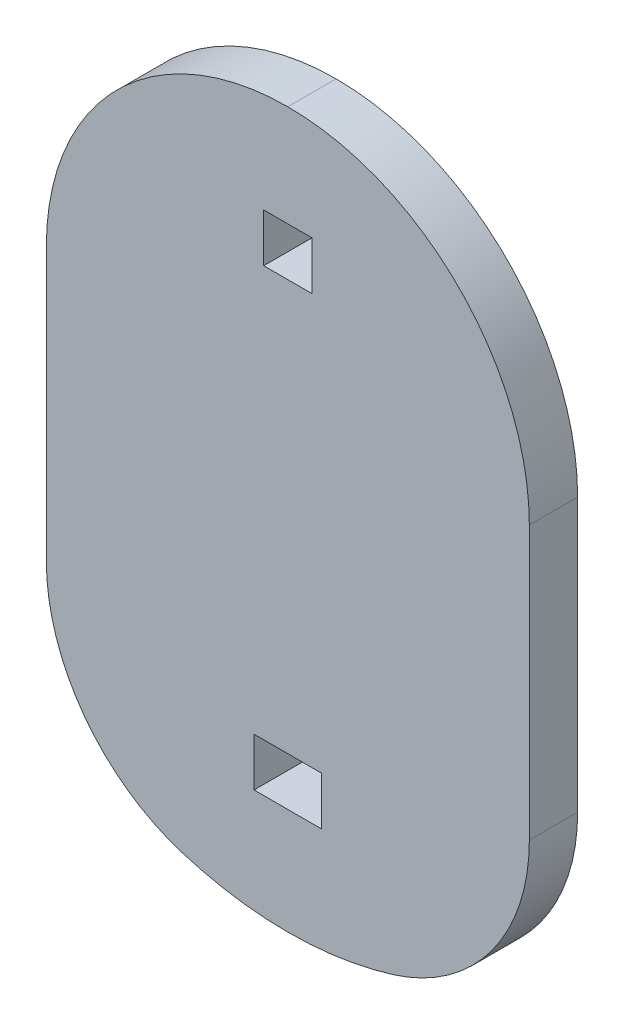
ISO-10303-21;
HEADER;
FILE_DESCRIPTION(('STEP AP214'),'2;1');
FILE_NAME('part.step','',(''),(''),'','','');
FILE_SCHEMA(('AUTOMOTIVE_DESIGN { 1 0 10303 214 1 1 1 1 }'));
ENDSEC;
DATA;
#1=APPLICATION_CONTEXT('core data for automotive mechanical design processes');
#2=APPLICATION_PROTOCOL_DEFINITION('international standard','automotive_design',2000,#1);
#3=PRODUCT_CONTEXT('',#1,'mechanical');
#4=PRODUCT('Part','Part','',(#3));
#5=PRODUCT_RELATED_PRODUCT_CATEGORY('part','',(#4));
#6=PRODUCT_DEFINITION_FORMATION('','',#4);
#7=PRODUCT_DEFINITION_CONTEXT('part definition',#1,'design');
#8=PRODUCT_DEFINITION('design','',#6,#7);
#9=PRODUCT_DEFINITION_SHAPE('','',#8);
#10=(LENGTH_UNIT() NAMED_UNIT(*) SI_UNIT(.MILLI.,.METRE.));
#11=(NAMED_UNIT(*) PLANE_ANGLE_UNIT() SI_UNIT($,.RADIAN.));
#12=(NAMED_UNIT(*) SI_UNIT($,.STERADIAN.) SOLID_ANGLE_UNIT());
#13=UNCERTAINTY_MEASURE_WITH_UNIT(LENGTH_MEASURE(1.E-05),#10,'distance_accuracy_value','');
#14=(GEOMETRIC_REPRESENTATION_CONTEXT(3) GLOBAL_UNCERTAINTY_ASSIGNED_CONTEXT((#13)) GLOBAL_UNIT_ASSIGNED_CONTEXT((#10,
#11,#12)) REPRESENTATION_CONTEXT('',''));
#15=CARTESIAN_POINT('',(0.,0.,0.));
#16=DIRECTION('',(0.,0.,1.));
#17=DIRECTION('',(1.,0.,0.));
#18=AXIS2_PLACEMENT_3D('',#15,#16,#17);
#19=CARTESIAN_POINT('',(0.,0.,5.));
#20=DIRECTION('',(0.,0.,-1.));
#21=DIRECTION('',(-1.,0.,0.));
#22=AXIS2_PLACEMENT_3D('',#19,#20,#21);
#23=CYLINDRICAL_SURFACE('',#22,37.);
#24=CARTESIAN_POINT('',(0.,0.,0.));
#25=DIRECTION('',(0.,0.,1.));
#26=DIRECTION('',(1.,0.,0.));
#27=AXIS2_PLACEMENT_3D('',#24,#25,#26);
#28=CIRCLE('',#27,37.);
#29=CARTESIAN_POINT('',(-10.8823529411765,-35.3634612907683,0.));
#30=VERTEX_POINT('',#29);
#31=CARTESIAN_POINT('',(10.8823529411765,-35.3634612907683,0.));
#32=VERTEX_POINT('',#31);
#33=EDGE_CURVE('E195',#30,#32,#28,.T.);
#34=ORIENTED_EDGE('',*,*,#33,.T.);
#35=DIRECTION('',(0.,0.,-1.));
#36=VECTOR('',#35,1.);
#37=CARTESIAN_POINT('',(10.8823529411765,-35.3634612907683,5.));
#38=LINE('',#37,#36);
#39=CARTESIAN_POINT('',(10.8823529411765,-35.3634612907683,5.));
#40=VERTEX_POINT('',#39);
#41=EDGE_CURVE('E227',#32,#40,#38,.F.);
#42=ORIENTED_EDGE('',*,*,#41,.T.);
#43=CARTESIAN_POINT('',(0.,0.,5.));
#44=DIRECTION('',(0.,0.,1.));
#45=DIRECTION('',(1.,0.,0.));
#46=AXIS2_PLACEMENT_3D('',#43,#44,#45);
#47=CIRCLE('',#46,37.);
#48=CARTESIAN_POINT('',(-10.8823529411765,-35.3634612907683,5.));
#49=VERTEX_POINT('',#48);
#50=EDGE_CURVE('E199',#49,#40,#47,.T.);
#51=ORIENTED_EDGE('',*,*,#50,.F.);
#52=DIRECTION('',(0.,0.,-1.));
#53=VECTOR('',#52,1.);
#54=CARTESIAN_POINT('',(-10.8823529411765,-35.3634612907683,5.));
#55=LINE('',#54,#53);
#56=EDGE_CURVE('E223',#49,#30,#55,.T.);
#57=ORIENTED_EDGE('',*,*,#56,.T.);
#58=EDGE_LOOP('',(#34,#42,#51,#57));
#59=FACE_BOUND('',#58,.T.);
#60=ADVANCED_FACE('F34',(#59),#23,.T.);
#61=CARTESIAN_POINT('',(0.,0.,5.));
#62=DIRECTION('',(0.,0.,1.));
#63=DIRECTION('',(1.,0.,0.));
#64=AXIS2_PLACEMENT_3D('',#61,#62,#63);
#65=PLANE('',#64);
#66=DIRECTION('',(0.,-1.,0.));
#67=VECTOR('',#66,1.);
#68=CARTESIAN_POINT('',(-2.5,26.5,5.));
#69=LINE('',#68,#67);
#70=CARTESIAN_POINT('',(-2.5,26.5,5.));
#71=VERTEX_POINT('',#70);
#72=CARTESIAN_POINT('',(-2.5,21.5,5.));
#73=VERTEX_POINT('',#72);
#74=EDGE_CURVE('E49',#71,#73,#69,.T.);
#75=ORIENTED_EDGE('',*,*,#74,.F.);
#76=DIRECTION('',(-1.,0.,0.));
#77=VECTOR('',#76,1.);
#78=CARTESIAN_POINT('',(-2.5,26.5,5.));
#79=LINE('',#78,#77);
#80=CARTESIAN_POINT('',(2.5,26.5,5.));
#81=VERTEX_POINT('',#80);
#82=EDGE_CURVE('E165',#81,#71,#79,.T.);
#83=ORIENTED_EDGE('',*,*,#82,.F.);
#84=DIRECTION('',(0.,1.,0.));
#85=VECTOR('',#84,1.);
#86=CARTESIAN_POINT('',(2.5,26.5,5.));
#87=LINE('',#86,#85);
#88=CARTESIAN_POINT('',(2.5,21.5,5.));
#89=VERTEX_POINT('',#88);
#90=EDGE_CURVE('E148',#89,#81,#87,.T.);
#91=ORIENTED_EDGE('',*,*,#90,.F.);
#92=DIRECTION('',(1.,0.,0.));
#93=VECTOR('',#92,1.);
#94=CARTESIAN_POINT('',(-2.5,21.5,5.));
#95=LINE('',#94,#93);
#96=EDGE_CURVE('E158',#73,#89,#95,.T.);
#97=ORIENTED_EDGE('',*,*,#96,.F.);
#98=EDGE_LOOP('',(#75,#83,#91,#97));
#99=FACE_BOUND('',#98,.T.);
#100=DIRECTION('',(0.,-1.,0.));
#101=VECTOR('',#100,1.);
#102=CARTESIAN_POINT('',(-3.5,-21.,5.));
#103=LINE('',#102,#101);
#104=CARTESIAN_POINT('',(-3.5,-21.,5.));
#105=VERTEX_POINT('',#104);
#106=CARTESIAN_POINT('',(-3.5,-26.,5.));
#107=VERTEX_POINT('',#106);
#108=EDGE_CURVE('E57',#105,#107,#103,.T.);
#109=ORIENTED_EDGE('',*,*,#108,.F.);
#110=DIRECTION('',(-1.,0.,0.));
#111=VECTOR('',#110,1.);
#112=CARTESIAN_POINT('',(-3.5,-21.,5.));
#113=LINE('',#112,#111);
#114=CARTESIAN_POINT('',(3.5,-21.,5.));
#115=VERTEX_POINT('',#114);
#116=EDGE_CURVE('E182',#115,#105,#113,.T.);
#117=ORIENTED_EDGE('',*,*,#116,.F.);
#118=DIRECTION('',(0.,1.,0.));
#119=VECTOR('',#118,1.);
#120=CARTESIAN_POINT('',(3.5,-21.,5.));
#121=LINE('',#120,#119);
#122=CARTESIAN_POINT('',(3.5,-26.,5.));
#123=VERTEX_POINT('',#122);
#124=EDGE_CURVE('E179',#123,#115,#121,.T.);
#125=ORIENTED_EDGE('',*,*,#124,.F.);
#126=DIRECTION('',(1.,0.,0.));
#127=VECTOR('',#126,1.);
#128=CARTESIAN_POINT('',(-3.5,-26.,5.));
#129=LINE('',#128,#127);
#130=EDGE_CURVE('E176',#107,#123,#129,.T.);
#131=ORIENTED_EDGE('',*,*,#130,.F.);
#132=EDGE_LOOP('',(#109,#117,#125,#131));
#133=FACE_BOUND('',#132,.T.);
#134=ORIENTED_EDGE('',*,*,#50,.T.);
#135=CARTESIAN_POINT('',(5.,-16.2480768092719,5.));
#136=DIRECTION('',(0.,0.,1.));
#137=DIRECTION('',(1.,0.,0.));
#138=AXIS2_PLACEMENT_3D('',#135,#136,#137);
#139=CIRCLE('',#138,20.);
#140=CARTESIAN_POINT('',(25.,-16.2480768092719,5.));
#141=VERTEX_POINT('',#140);
#142=EDGE_CURVE('E232',#40,#141,#139,.T.);
#143=ORIENTED_EDGE('',*,*,#142,.T.);
#144=DIRECTION('',(0.,-1.,0.));
#145=VECTOR('',#144,1.);
#146=CARTESIAN_POINT('',(25.,-27.2763633939717,5.));
#147=LINE('',#146,#145);
#148=CARTESIAN_POINT('',(25.,12.,5.));
#149=VERTEX_POINT('',#148);
#150=EDGE_CURVE('E196',#149,#141,#147,.T.);
#151=ORIENTED_EDGE('',*,*,#150,.F.);
#152=CARTESIAN_POINT('',(0.,12.,5.));
#153=DIRECTION('',(0.,0.,1.));
#154=DIRECTION('',(1.,0.,0.));
#155=AXIS2_PLACEMENT_3D('',#152,#153,#154);
#156=CIRCLE('',#155,25.);
#157=CARTESIAN_POINT('',(0.,37.,5.));
#158=VERTEX_POINT('',#157);
#159=EDGE_CURVE('E209',#149,#158,#156,.T.);
#160=ORIENTED_EDGE('',*,*,#159,.T.);
#161=CARTESIAN_POINT('',(0.,12.,5.));
#162=DIRECTION('',(0.,0.,1.));
#163=DIRECTION('',(1.,0.,0.));
#164=AXIS2_PLACEMENT_3D('',#161,#162,#163);
#165=CIRCLE('',#164,25.);
#166=CARTESIAN_POINT('',(-25.,12.,5.));
#167=VERTEX_POINT('',#166);
#168=EDGE_CURVE('E211',#158,#167,#165,.T.);
#169=ORIENTED_EDGE('',*,*,#168,.T.);
#170=DIRECTION('',(0.,1.,0.));
#171=VECTOR('',#170,1.);
#172=CARTESIAN_POINT('',(-25.,27.2763633939717,5.));
#173=LINE('',#172,#171);
#174=CARTESIAN_POINT('',(-25.,-16.2480768092719,5.));
#175=VERTEX_POINT('',#174);
#176=EDGE_CURVE('E193',#175,#167,#173,.T.);
#177=ORIENTED_EDGE('',*,*,#176,.F.);
#178=CARTESIAN_POINT('',(-4.99999999999999,-16.2480768092719,5.));
#179=DIRECTION('',(0.,0.,1.));
#180=DIRECTION('',(1.,0.,0.));
#181=AXIS2_PLACEMENT_3D('',#178,#179,#180);
#182=CIRCLE('',#181,20.);
#183=EDGE_CURVE('E230',#175,#49,#182,.T.);
#184=ORIENTED_EDGE('',*,*,#183,.T.);
#185=EDGE_LOOP('',(#134,#143,#151,#160,#169,#177,#184));
#186=FACE_BOUND('',#185,.T.);
#187=ADVANCED_FACE('F162',(#99,#133,#186),#65,.T.);
#188=CARTESIAN_POINT('',(0.,0.,0.));
#189=DIRECTION('',(0.,0.,1.));
#190=DIRECTION('',(1.,0.,0.));
#191=AXIS2_PLACEMENT_3D('',#188,#189,#190);
#192=PLANE('',#191);
#193=DIRECTION('',(-1.,0.,0.));
#194=VECTOR('',#193,1.);
#195=CARTESIAN_POINT('',(0.,26.5,0.));
#196=LINE('',#195,#194);
#197=CARTESIAN_POINT('',(2.5,26.5,0.));
#198=VERTEX_POINT('',#197);
#199=CARTESIAN_POINT('',(-2.5,26.5,0.));
#200=VERTEX_POINT('',#199);
#201=EDGE_CURVE('E42',#198,#200,#196,.T.);
#202=ORIENTED_EDGE('',*,*,#201,.T.);
#203=DIRECTION('',(0.,-1.,0.));
#204=VECTOR('',#203,1.);
#205=CARTESIAN_POINT('',(-2.5,0.,0.));
#206=LINE('',#205,#204);
#207=CARTESIAN_POINT('',(-2.5,21.5,0.));
#208=VERTEX_POINT('',#207);
#209=EDGE_CURVE('E11',#200,#208,#206,.T.);
#210=ORIENTED_EDGE('',*,*,#209,.T.);
#211=DIRECTION('',(1.,0.,0.));
#212=VECTOR('',#211,1.);
#213=CARTESIAN_POINT('',(0.,21.5,0.));
#214=LINE('',#213,#212);
#215=CARTESIAN_POINT('',(2.5,21.5,0.));
#216=VERTEX_POINT('',#215);
#217=EDGE_CURVE('E255',#208,#216,#214,.T.);
#218=ORIENTED_EDGE('',*,*,#217,.T.);
#219=DIRECTION('',(0.,1.,0.));
#220=VECTOR('',#219,1.);
#221=CARTESIAN_POINT('',(2.5,0.,0.));
#222=LINE('',#221,#220);
#223=EDGE_CURVE('E151',#216,#198,#222,.T.);
#224=ORIENTED_EDGE('',*,*,#223,.T.);
#225=EDGE_LOOP('',(#202,#210,#218,#224));
#226=FACE_BOUND('',#225,.T.);
#227=DIRECTION('',(-1.,0.,0.));
#228=VECTOR('',#227,1.);
#229=CARTESIAN_POINT('',(0.,-21.,0.));
#230=LINE('',#229,#228);
#231=CARTESIAN_POINT('',(3.5,-21.,0.));
#232=VERTEX_POINT('',#231);
#233=CARTESIAN_POINT('',(-3.5,-21.,0.));
#234=VERTEX_POINT('',#233);
#235=EDGE_CURVE('E249',#232,#234,#230,.T.);
#236=ORIENTED_EDGE('',*,*,#235,.T.);
#237=DIRECTION('',(0.,-1.,0.));
#238=VECTOR('',#237,1.);
#239=CARTESIAN_POINT('',(-3.5,0.,0.));
#240=LINE('',#239,#238);
#241=CARTESIAN_POINT('',(-3.5,-26.,0.));
#242=VERTEX_POINT('',#241);
#243=EDGE_CURVE('E252',#234,#242,#240,.T.);
#244=ORIENTED_EDGE('',*,*,#243,.T.);
#245=DIRECTION('',(1.,0.,0.));
#246=VECTOR('',#245,1.);
#247=CARTESIAN_POINT('',(0.,-26.,0.));
#248=LINE('',#247,#246);
#249=CARTESIAN_POINT('',(3.5,-26.,0.));
#250=VERTEX_POINT('',#249);
#251=EDGE_CURVE('E243',#242,#250,#248,.T.);
#252=ORIENTED_EDGE('',*,*,#251,.T.);
#253=DIRECTION('',(0.,1.,0.));
#254=VECTOR('',#253,1.);
#255=CARTESIAN_POINT('',(3.5,0.,0.));
#256=LINE('',#255,#254);
#257=EDGE_CURVE('E246',#250,#232,#256,.T.);
#258=ORIENTED_EDGE('',*,*,#257,.T.);
#259=EDGE_LOOP('',(#236,#244,#252,#258));
#260=FACE_BOUND('',#259,.T.);
#261=DIRECTION('',(0.,-1.,0.));
#262=VECTOR('',#261,1.);
#263=CARTESIAN_POINT('',(25.,0.,0.));
#264=LINE('',#263,#262);
#265=CARTESIAN_POINT('',(25.,12.,0.));
#266=VERTEX_POINT('',#265);
#267=CARTESIAN_POINT('',(25.,-16.2480768092719,0.));
#268=VERTEX_POINT('',#267);
#269=EDGE_CURVE('E202',#266,#268,#264,.T.);
#270=ORIENTED_EDGE('',*,*,#269,.T.);
#271=CARTESIAN_POINT('',(5.,-16.2480768092719,0.));
#272=DIRECTION('',(0.,0.,1.));
#273=DIRECTION('',(1.,0.,0.));
#274=AXIS2_PLACEMENT_3D('',#271,#272,#273);
#275=CIRCLE('',#274,20.);
#276=EDGE_CURVE('E238',#268,#32,#275,.F.);
#277=ORIENTED_EDGE('',*,*,#276,.T.);
#278=ORIENTED_EDGE('',*,*,#33,.F.);
#279=CARTESIAN_POINT('',(-4.99999999999999,-16.2480768092719,0.));
#280=DIRECTION('',(0.,0.,1.));
#281=DIRECTION('',(1.,0.,0.));
#282=AXIS2_PLACEMENT_3D('',#279,#280,#281);
#283=CIRCLE('',#282,20.);
#284=CARTESIAN_POINT('',(-25.,-16.2480768092719,0.));
#285=VERTEX_POINT('',#284);
#286=EDGE_CURVE('E236',#30,#285,#283,.F.);
#287=ORIENTED_EDGE('',*,*,#286,.T.);
#288=DIRECTION('',(0.,1.,0.));
#289=VECTOR('',#288,1.);
#290=CARTESIAN_POINT('',(-25.,0.,0.));
#291=LINE('',#290,#289);
#292=CARTESIAN_POINT('',(-25.,12.,0.));
#293=VERTEX_POINT('',#292);
#294=EDGE_CURVE('E207',#285,#293,#291,.T.);
#295=ORIENTED_EDGE('',*,*,#294,.T.);
#296=CARTESIAN_POINT('',(0.,12.,0.));
#297=DIRECTION('',(0.,0.,1.));
#298=DIRECTION('',(1.,0.,0.));
#299=AXIS2_PLACEMENT_3D('',#296,#297,#298);
#300=CIRCLE('',#299,25.);
#301=CARTESIAN_POINT('',(0.,37.,0.));
#302=VERTEX_POINT('',#301);
#303=EDGE_CURVE('E219',#293,#302,#300,.F.);
#304=ORIENTED_EDGE('',*,*,#303,.T.);
#305=CARTESIAN_POINT('',(0.,12.,0.));
#306=DIRECTION('',(0.,0.,1.));
#307=DIRECTION('',(1.,0.,0.));
#308=AXIS2_PLACEMENT_3D('',#305,#306,#307);
#309=CIRCLE('',#308,25.);
#310=EDGE_CURVE('E217',#302,#266,#309,.F.);
#311=ORIENTED_EDGE('',*,*,#310,.T.);
#312=EDGE_LOOP('',(#270,#277,#278,#287,#295,#304,#311));
#313=FACE_BOUND('',#312,.T.);
#314=ADVANCED_FACE('F259',(#226,#260,#313),#192,.F.);
#315=CARTESIAN_POINT('',(25.,-27.2763633939717,-5.));
#316=DIRECTION('',(-1.,0.,0.));
#317=DIRECTION('',(0.,0.,1.));
#318=AXIS2_PLACEMENT_3D('',#315,#316,#317);
#319=PLANE('',#318);
#320=ORIENTED_EDGE('',*,*,#150,.T.);
#321=DIRECTION('',(0.,0.,-1.));
#322=VECTOR('',#321,1.);
#323=CARTESIAN_POINT('',(25.,-16.2480768092719,-5.));
#324=LINE('',#323,#322);
#325=EDGE_CURVE('E234',#141,#268,#324,.T.);
#326=ORIENTED_EDGE('',*,*,#325,.T.);
#327=ORIENTED_EDGE('',*,*,#269,.F.);
#328=DIRECTION('',(0.,0.,-1.));
#329=VECTOR('',#328,1.);
#330=CARTESIAN_POINT('',(25.,12.,-5.));
#331=LINE('',#330,#329);
#332=EDGE_CURVE('E221',#266,#149,#331,.F.);
#333=ORIENTED_EDGE('',*,*,#332,.T.);
#334=EDGE_LOOP('',(#320,#326,#327,#333));
#335=FACE_BOUND('',#334,.T.);
#336=ADVANCED_FACE('F325',(#335),#319,.F.);
#337=CARTESIAN_POINT('',(-25.,27.2763633939717,-5.));
#338=DIRECTION('',(1.,0.,0.));
#339=DIRECTION('',(0.,0.,-1.));
#340=AXIS2_PLACEMENT_3D('',#337,#338,#339);
#341=PLANE('',#340);
#342=ORIENTED_EDGE('',*,*,#294,.F.);
#343=DIRECTION('',(0.,0.,-1.));
#344=VECTOR('',#343,1.);
#345=CARTESIAN_POINT('',(-25.,-16.2480768092719,-5.));
#346=LINE('',#345,#344);
#347=EDGE_CURVE('E240',#285,#175,#346,.F.);
#348=ORIENTED_EDGE('',*,*,#347,.T.);
#349=ORIENTED_EDGE('',*,*,#176,.T.);
#350=DIRECTION('',(0.,0.,-1.));
#351=VECTOR('',#350,1.);
#352=CARTESIAN_POINT('',(-25.,12.,-5.));
#353=LINE('',#352,#351);
#354=EDGE_CURVE('E214',#167,#293,#353,.T.);
#355=ORIENTED_EDGE('',*,*,#354,.T.);
#356=EDGE_LOOP('',(#342,#348,#349,#355));
#357=FACE_BOUND('',#356,.T.);
#358=ADVANCED_FACE('F294',(#357),#341,.F.);
#359=CARTESIAN_POINT('',(0.,12.,5.));
#360=DIRECTION('',(0.,0.,-1.));
#361=DIRECTION('',(-1.,0.,0.));
#362=AXIS2_PLACEMENT_3D('',#359,#360,#361);
#363=CYLINDRICAL_SURFACE('',#362,25.);
#364=ORIENTED_EDGE('',*,*,#332,.F.);
#365=ORIENTED_EDGE('',*,*,#310,.F.);
#366=DIRECTION('',(0.,0.,-1.));
#367=VECTOR('',#366,1.);
#368=CARTESIAN_POINT('',(0.,37.,5.));
#369=LINE('',#368,#367);
#370=EDGE_CURVE('E172',#158,#302,#369,.T.);
#371=ORIENTED_EDGE('',*,*,#370,.F.);
#372=ORIENTED_EDGE('',*,*,#159,.F.);
#373=EDGE_LOOP('',(#364,#365,#371,#372));
#374=FACE_BOUND('',#373,.T.);
#375=ADVANCED_FACE('F291',(#374),#363,.T.);
#376=CARTESIAN_POINT('',(0.,12.,5.));
#377=DIRECTION('',(0.,0.,-1.));
#378=DIRECTION('',(-1.,0.,0.));
#379=AXIS2_PLACEMENT_3D('',#376,#377,#378);
#380=CYLINDRICAL_SURFACE('',#379,25.);
#381=ORIENTED_EDGE('',*,*,#303,.F.);
#382=ORIENTED_EDGE('',*,*,#354,.F.);
#383=ORIENTED_EDGE('',*,*,#168,.F.);
#384=ORIENTED_EDGE('',*,*,#370,.T.);
#385=EDGE_LOOP('',(#381,#382,#383,#384));
#386=FACE_BOUND('',#385,.T.);
#387=ADVANCED_FACE('F287',(#386),#380,.T.);
#388=CARTESIAN_POINT('',(5.,-16.2480768092719,5.));
#389=DIRECTION('',(0.,0.,-1.));
#390=DIRECTION('',(-1.,0.,0.));
#391=AXIS2_PLACEMENT_3D('',#388,#389,#390);
#392=CYLINDRICAL_SURFACE('',#391,20.);
#393=ORIENTED_EDGE('',*,*,#276,.F.);
#394=ORIENTED_EDGE('',*,*,#325,.F.);
#395=ORIENTED_EDGE('',*,*,#142,.F.);
#396=ORIENTED_EDGE('',*,*,#41,.F.);
#397=EDGE_LOOP('',(#393,#394,#395,#396));
#398=FACE_BOUND('',#397,.T.);
#399=ADVANCED_FACE('F290',(#398),#392,.T.);
#400=CARTESIAN_POINT('',(-4.99999999999999,-16.2480768092719,5.));
#401=DIRECTION('',(0.,0.,-1.));
#402=DIRECTION('',(-1.,0.,0.));
#403=AXIS2_PLACEMENT_3D('',#400,#401,#402);
#404=CYLINDRICAL_SURFACE('',#403,20.);
#405=ORIENTED_EDGE('',*,*,#286,.F.);
#406=ORIENTED_EDGE('',*,*,#56,.F.);
#407=ORIENTED_EDGE('',*,*,#183,.F.);
#408=ORIENTED_EDGE('',*,*,#347,.F.);
#409=EDGE_LOOP('',(#405,#406,#407,#408));
#410=FACE_BOUND('',#409,.T.);
#411=ADVANCED_FACE('F36',(#410),#404,.T.);
#412=CARTESIAN_POINT('',(-3.5,-21.,-5.));
#413=DIRECTION('',(-1.,0.,0.));
#414=DIRECTION('',(0.,-1.,0.));
#415=AXIS2_PLACEMENT_3D('',#412,#413,#414);
#416=PLANE('',#415);
#417=DIRECTION('',(0.,0.,1.));
#418=VECTOR('',#417,1.);
#419=CARTESIAN_POINT('',(-3.5,-21.,-5.));
#420=LINE('',#419,#418);
#421=EDGE_CURVE('E186',#234,#105,#420,.T.);
#422=ORIENTED_EDGE('',*,*,#421,.T.);
#423=ORIENTED_EDGE('',*,*,#108,.T.);
#424=DIRECTION('',(0.,0.,1.));
#425=VECTOR('',#424,1.);
#426=CARTESIAN_POINT('',(-3.5,-26.,-5.));
#427=LINE('',#426,#425);
#428=EDGE_CURVE('E185',#242,#107,#427,.T.);
#429=ORIENTED_EDGE('',*,*,#428,.F.);
#430=ORIENTED_EDGE('',*,*,#243,.F.);
#431=EDGE_LOOP('',(#422,#423,#429,#430));
#432=FACE_BOUND('',#431,.T.);
#433=ADVANCED_FACE('F301',(#432),#416,.F.);
#434=CARTESIAN_POINT('',(-3.5,-21.,-5.));
#435=DIRECTION('',(0.,1.,0.));
#436=DIRECTION('',(0.,0.,1.));
#437=AXIS2_PLACEMENT_3D('',#434,#435,#436);
#438=PLANE('',#437);
#439=DIRECTION('',(0.,0.,1.));
#440=VECTOR('',#439,1.);
#441=CARTESIAN_POINT('',(3.5,-21.,-5.));
#442=LINE('',#441,#440);
#443=EDGE_CURVE('E188',#232,#115,#442,.T.);
#444=ORIENTED_EDGE('',*,*,#443,.T.);
#445=ORIENTED_EDGE('',*,*,#116,.T.);
#446=ORIENTED_EDGE('',*,*,#421,.F.);
#447=ORIENTED_EDGE('',*,*,#235,.F.);
#448=EDGE_LOOP('',(#444,#445,#446,#447));
#449=FACE_BOUND('',#448,.T.);
#450=ADVANCED_FACE('F336',(#449),#438,.F.);
#451=CARTESIAN_POINT('',(3.5,-21.,-5.));
#452=DIRECTION('',(1.,0.,0.));
#453=DIRECTION('',(0.,1.,0.));
#454=AXIS2_PLACEMENT_3D('',#451,#452,#453);
#455=PLANE('',#454);
#456=DIRECTION('',(0.,0.,1.));
#457=VECTOR('',#456,1.);
#458=CARTESIAN_POINT('',(3.5,-26.,-5.));
#459=LINE('',#458,#457);
#460=EDGE_CURVE('E190',#250,#123,#459,.T.);
#461=ORIENTED_EDGE('',*,*,#460,.T.);
#462=ORIENTED_EDGE('',*,*,#124,.T.);
#463=ORIENTED_EDGE('',*,*,#443,.F.);
#464=ORIENTED_EDGE('',*,*,#257,.F.);
#465=EDGE_LOOP('',(#461,#462,#463,#464));
#466=FACE_BOUND('',#465,.T.);
#467=ADVANCED_FACE('F273',(#466),#455,.F.);
#468=CARTESIAN_POINT('',(-3.5,-26.,-5.));
#469=DIRECTION('',(0.,-1.,0.));
#470=DIRECTION('',(0.,0.,-1.));
#471=AXIS2_PLACEMENT_3D('',#468,#469,#470);
#472=PLANE('',#471);
#473=ORIENTED_EDGE('',*,*,#428,.T.);
#474=ORIENTED_EDGE('',*,*,#130,.T.);
#475=ORIENTED_EDGE('',*,*,#460,.F.);
#476=ORIENTED_EDGE('',*,*,#251,.F.);
#477=EDGE_LOOP('',(#473,#474,#475,#476));
#478=FACE_BOUND('',#477,.T.);
#479=ADVANCED_FACE('F266',(#478),#472,.F.);
#480=CARTESIAN_POINT('',(-2.5,26.5,-5.));
#481=DIRECTION('',(-1.,0.,0.));
#482=DIRECTION('',(0.,-1.,0.));
#483=AXIS2_PLACEMENT_3D('',#480,#481,#482);
#484=PLANE('',#483);
#485=DIRECTION('',(0.,0.,1.));
#486=VECTOR('',#485,1.);
#487=CARTESIAN_POINT('',(-2.5,26.5,-5.));
#488=LINE('',#487,#486);
#489=EDGE_CURVE('E170',#200,#71,#488,.T.);
#490=ORIENTED_EDGE('',*,*,#489,.T.);
#491=ORIENTED_EDGE('',*,*,#74,.T.);
#492=DIRECTION('',(0.,0.,1.));
#493=VECTOR('',#492,1.);
#494=CARTESIAN_POINT('',(-2.5,21.5,-5.));
#495=LINE('',#494,#493);
#496=EDGE_CURVE('E155',#208,#73,#495,.T.);
#497=ORIENTED_EDGE('',*,*,#496,.F.);
#498=ORIENTED_EDGE('',*,*,#209,.F.);
#499=EDGE_LOOP('',(#490,#491,#497,#498));
#500=FACE_BOUND('',#499,.T.);
#501=ADVANCED_FACE('F264',(#500),#484,.F.);
#502=CARTESIAN_POINT('',(-2.5,26.5,-5.));
#503=DIRECTION('',(0.,1.,0.));
#504=DIRECTION('',(0.,0.,1.));
#505=AXIS2_PLACEMENT_3D('',#502,#503,#504);
#506=PLANE('',#505);
#507=DIRECTION('',(0.,0.,1.));
#508=VECTOR('',#507,1.);
#509=CARTESIAN_POINT('',(2.5,26.5,-5.));
#510=LINE('',#509,#508);
#511=EDGE_CURVE('E154',#198,#81,#510,.T.);
#512=ORIENTED_EDGE('',*,*,#511,.T.);
#513=ORIENTED_EDGE('',*,*,#82,.T.);
#514=ORIENTED_EDGE('',*,*,#489,.F.);
#515=ORIENTED_EDGE('',*,*,#201,.F.);
#516=EDGE_LOOP('',(#512,#513,#514,#515));
#517=FACE_BOUND('',#516,.T.);
#518=ADVANCED_FACE('F263',(#517),#506,.F.);
#519=CARTESIAN_POINT('',(2.5,26.5,-5.));
#520=DIRECTION('',(1.,0.,0.));
#521=DIRECTION('',(0.,1.,0.));
#522=AXIS2_PLACEMENT_3D('',#519,#520,#521);
#523=PLANE('',#522);
#524=DIRECTION('',(0.,0.,1.));
#525=VECTOR('',#524,1.);
#526=CARTESIAN_POINT('',(2.5,21.5,-5.));
#527=LINE('',#526,#525);
#528=EDGE_CURVE('E143',#216,#89,#527,.T.);
#529=ORIENTED_EDGE('',*,*,#528,.T.);
#530=ORIENTED_EDGE('',*,*,#90,.T.);
#531=ORIENTED_EDGE('',*,*,#511,.F.);
#532=ORIENTED_EDGE('',*,*,#223,.F.);
#533=EDGE_LOOP('',(#529,#530,#531,#532));
#534=FACE_BOUND('',#533,.T.);
#535=ADVANCED_FACE('F145',(#534),#523,.F.);
#536=CARTESIAN_POINT('',(-2.5,21.5,-5.));
#537=DIRECTION('',(0.,-1.,0.));
#538=DIRECTION('',(0.,0.,-1.));
#539=AXIS2_PLACEMENT_3D('',#536,#537,#538);
#540=PLANE('',#539);
#541=ORIENTED_EDGE('',*,*,#496,.T.);
#542=ORIENTED_EDGE('',*,*,#96,.T.);
#543=ORIENTED_EDGE('',*,*,#528,.F.);
#544=ORIENTED_EDGE('',*,*,#217,.F.);
#545=EDGE_LOOP('',(#541,#542,#543,#544));
#546=FACE_BOUND('',#545,.T.);
#547=ADVANCED_FACE('F159',(#546),#540,.F.);
#548=CLOSED_SHELL('',(#60,#187,#314,#336,#358,#375,#387,#399,#411,#433,#450,#467,#479,#501,#518,
#535,#547));
#549=MANIFOLD_SOLID_BREP('B2',#548);
#550=ADVANCED_BREP_SHAPE_REPRESENTATION('',(#18,#549),#14);
#551=SHAPE_DEFINITION_REPRESENTATION(#9,#550);
ENDSEC;
END-ISO-10303-21;
